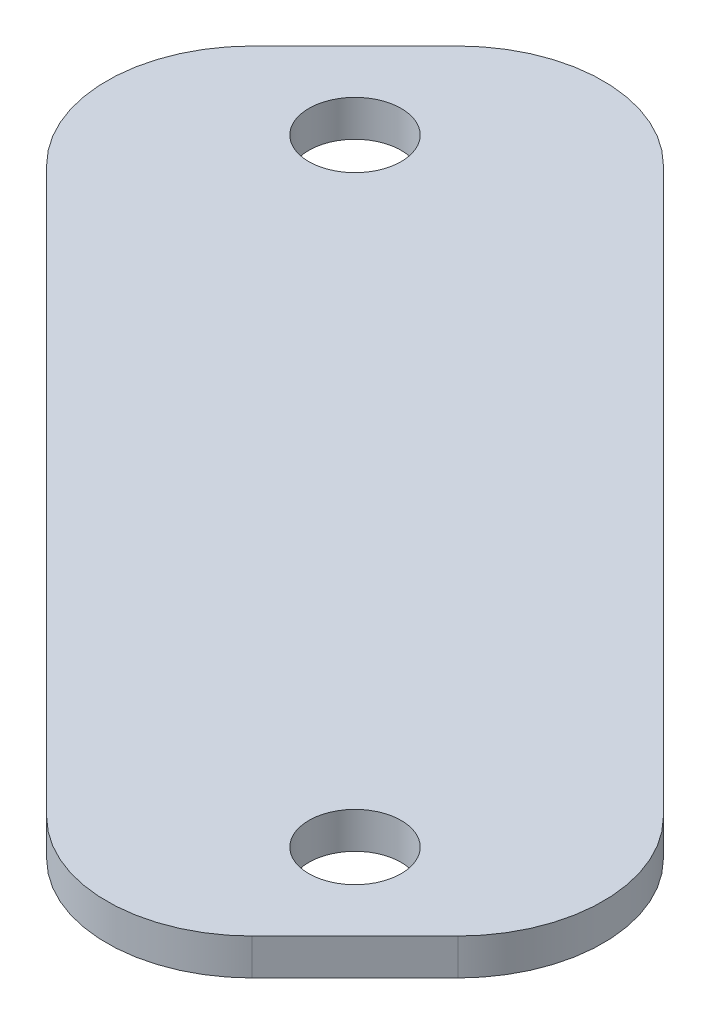
ISO-10303-21;
HEADER;
FILE_DESCRIPTION(('STEP AP214'),'2;1');
FILE_NAME('part.step','',(''),(''),'','','');
FILE_SCHEMA(('AUTOMOTIVE_DESIGN { 1 0 10303 214 1 1 1 1 }'));
ENDSEC;
DATA;
#1=APPLICATION_CONTEXT('core data for automotive mechanical design processes');
#2=APPLICATION_PROTOCOL_DEFINITION('international standard','automotive_design',2000,#1);
#3=PRODUCT_CONTEXT('',#1,'mechanical');
#4=PRODUCT('Part','Part','',(#3));
#5=PRODUCT_RELATED_PRODUCT_CATEGORY('part','',(#4));
#6=PRODUCT_DEFINITION_FORMATION('','',#4);
#7=PRODUCT_DEFINITION_CONTEXT('part definition',#1,'design');
#8=PRODUCT_DEFINITION('design','',#6,#7);
#9=PRODUCT_DEFINITION_SHAPE('','',#8);
#10=(LENGTH_UNIT() NAMED_UNIT(*) SI_UNIT(.MILLI.,.METRE.));
#11=(NAMED_UNIT(*) PLANE_ANGLE_UNIT() SI_UNIT($,.RADIAN.));
#12=(NAMED_UNIT(*) SI_UNIT($,.STERADIAN.) SOLID_ANGLE_UNIT());
#13=UNCERTAINTY_MEASURE_WITH_UNIT(LENGTH_MEASURE(1.E-05),#10,'distance_accuracy_value','');
#14=(GEOMETRIC_REPRESENTATION_CONTEXT(3) GLOBAL_UNCERTAINTY_ASSIGNED_CONTEXT((#13)) GLOBAL_UNIT_ASSIGNED_CONTEXT((#10,
#11,#12)) REPRESENTATION_CONTEXT('',''));
#15=CARTESIAN_POINT('',(0.,0.,0.));
#16=DIRECTION('',(0.,0.,1.));
#17=DIRECTION('',(1.,0.,0.));
#18=AXIS2_PLACEMENT_3D('',#15,#16,#17);
#19=CARTESIAN_POINT('',(42.4264068711928,10.,-42.4264068711928));
#20=DIRECTION('',(0.707106781186548,0.,-0.707106781186548));
#21=DIRECTION('',(-0.707106781186548,0.,-0.707106781186548));
#22=AXIS2_PLACEMENT_3D('',#19,#20,#21);
#23=PLANE('',#22);
#24=DIRECTION('',(0.707106781186548,0.,0.707106781186548));
#25=VECTOR('',#24,1.);
#26=CARTESIAN_POINT('',(42.4264068711928,10.,-42.4264068711928));
#27=LINE('',#26,#25);
#28=CARTESIAN_POINT('',(-35.3553390593274,10.,-120.208152801713));
#29=VERTEX_POINT('',#28);
#30=CARTESIAN_POINT('',(120.208152801713,10.,35.3553390593274));
#31=VERTEX_POINT('',#30);
#32=EDGE_CURVE('E134',#29,#31,#27,.T.);
#33=ORIENTED_EDGE('',*,*,#32,.T.);
#34=DIRECTION('',(0.,-1.,0.));
#35=VECTOR('',#34,1.);
#36=CARTESIAN_POINT('',(120.208152801713,0.,35.3553390593274));
#37=LINE('',#36,#35);
#38=CARTESIAN_POINT('',(120.208152801713,0.,35.3553390593274));
#39=VERTEX_POINT('',#38);
#40=EDGE_CURVE('E161',#31,#39,#37,.T.);
#41=ORIENTED_EDGE('',*,*,#40,.T.);
#42=DIRECTION('',(0.707106781186548,0.,0.707106781186548));
#43=VECTOR('',#42,1.);
#44=CARTESIAN_POINT('',(42.4264068711928,0.,-42.4264068711928));
#45=LINE('',#44,#43);
#46=CARTESIAN_POINT('',(-35.3553390593274,0.,-120.208152801713));
#47=VERTEX_POINT('',#46);
#48=EDGE_CURVE('E169',#47,#39,#45,.T.);
#49=ORIENTED_EDGE('',*,*,#48,.F.);
#50=DIRECTION('',(0.,-1.,0.));
#51=VECTOR('',#50,1.);
#52=CARTESIAN_POINT('',(-35.3553390593273,10.,-120.208152801713));
#53=LINE('',#52,#51);
#54=EDGE_CURVE('E159',#47,#29,#53,.F.);
#55=ORIENTED_EDGE('',*,*,#54,.T.);
#56=EDGE_LOOP('',(#33,#41,#49,#55));
#57=FACE_BOUND('',#56,.T.);
#58=ADVANCED_FACE('F43',(#57),#23,.T.);
#59=CARTESIAN_POINT('',(-106.066017177982,10.,-106.066017177982));
#60=DIRECTION('',(-0.707106781186548,0.,-0.707106781186548));
#61=DIRECTION('',(-0.707106781186548,0.,0.707106781186548));
#62=AXIS2_PLACEMENT_3D('',#59,#60,#61);
#63=PLANE('',#62);
#64=DIRECTION('',(0.707106781186548,0.,-0.707106781186548));
#65=VECTOR('',#64,1.);
#66=CARTESIAN_POINT('',(-106.066017177982,0.,-106.066017177982));
#67=LINE('',#66,#65);
#68=CARTESIAN_POINT('',(-120.208152801713,0.,-91.9238815542512));
#69=VERTEX_POINT('',#68);
#70=CARTESIAN_POINT('',(-91.9238815542512,0.,-120.208152801713));
#71=VERTEX_POINT('',#70);
#72=EDGE_CURVE('E140',#69,#71,#67,.T.);
#73=ORIENTED_EDGE('',*,*,#72,.F.);
#74=DIRECTION('',(0.,-1.,0.));
#75=VECTOR('',#74,1.);
#76=CARTESIAN_POINT('',(-120.208152801713,10.,-91.9238815542512));
#77=LINE('',#76,#75);
#78=CARTESIAN_POINT('',(-120.208152801713,10.,-91.9238815542512));
#79=VERTEX_POINT('',#78);
#80=EDGE_CURVE('E11',#69,#79,#77,.F.);
#81=ORIENTED_EDGE('',*,*,#80,.T.);
#82=DIRECTION('',(0.707106781186548,0.,-0.707106781186548));
#83=VECTOR('',#82,1.);
#84=CARTESIAN_POINT('',(-106.066017177982,10.,-106.066017177982));
#85=LINE('',#84,#83);
#86=CARTESIAN_POINT('',(-91.9238815542512,10.,-120.208152801713));
#87=VERTEX_POINT('',#86);
#88=EDGE_CURVE('E138',#79,#87,#85,.T.);
#89=ORIENTED_EDGE('',*,*,#88,.T.);
#90=DIRECTION('',(0.,-1.,0.));
#91=VECTOR('',#90,1.);
#92=CARTESIAN_POINT('',(-91.9238815542512,10.,-120.208152801713));
#93=LINE('',#92,#91);
#94=EDGE_CURVE('E51',#87,#71,#93,.T.);
#95=ORIENTED_EDGE('',*,*,#94,.T.);
#96=EDGE_LOOP('',(#73,#81,#89,#95));
#97=FACE_BOUND('',#96,.T.);
#98=ADVANCED_FACE('F166',(#97),#63,.T.);
#99=CARTESIAN_POINT('',(-42.4264068711928,10.,42.4264068711928));
#100=DIRECTION('',(0.707106781186548,0.,-0.707106781186548));
#101=DIRECTION('',(-0.707106781186548,0.,-0.707106781186548));
#102=AXIS2_PLACEMENT_3D('',#99,#100,#101);
#103=PLANE('',#102);
#104=DIRECTION('',(0.707106781186548,0.,0.707106781186548));
#105=VECTOR('',#104,1.);
#106=CARTESIAN_POINT('',(-42.4264068711928,0.,42.4264068711928));
#107=LINE('',#106,#105);
#108=CARTESIAN_POINT('',(-120.208152801713,0.,-35.3553390593273));
#109=VERTEX_POINT('',#108);
#110=CARTESIAN_POINT('',(35.3553390593274,0.,120.208152801713));
#111=VERTEX_POINT('',#110);
#112=EDGE_CURVE('E135',#109,#111,#107,.T.);
#113=ORIENTED_EDGE('',*,*,#112,.T.);
#114=DIRECTION('',(0.,-1.,0.));
#115=VECTOR('',#114,1.);
#116=CARTESIAN_POINT('',(35.3553390593274,10.,120.208152801713));
#117=LINE('',#116,#115);
#118=CARTESIAN_POINT('',(35.3553390593274,10.,120.208152801713));
#119=VERTEX_POINT('',#118);
#120=EDGE_CURVE('E113',#111,#119,#117,.F.);
#121=ORIENTED_EDGE('',*,*,#120,.T.);
#122=DIRECTION('',(0.707106781186548,0.,0.707106781186548));
#123=VECTOR('',#122,1.);
#124=CARTESIAN_POINT('',(-42.4264068711928,10.,42.4264068711928));
#125=LINE('',#124,#123);
#126=CARTESIAN_POINT('',(-120.208152801713,10.,-35.3553390593273));
#127=VERTEX_POINT('',#126);
#128=EDGE_CURVE('E174',#127,#119,#125,.T.);
#129=ORIENTED_EDGE('',*,*,#128,.F.);
#130=DIRECTION('',(0.,-1.,0.));
#131=VECTOR('',#130,1.);
#132=CARTESIAN_POINT('',(-120.208152801713,0.,-35.3553390593273));
#133=LINE('',#132,#131);
#134=EDGE_CURVE('E118',#127,#109,#133,.T.);
#135=ORIENTED_EDGE('',*,*,#134,.T.);
#136=EDGE_LOOP('',(#113,#121,#129,#135));
#137=FACE_BOUND('',#136,.T.);
#138=ADVANCED_FACE('F208',(#137),#103,.F.);
#139=CARTESIAN_POINT('',(106.066017177982,10.,106.066017177982));
#140=DIRECTION('',(-0.707106781186547,0.,-0.707106781186548));
#141=DIRECTION('',(-0.707106781186548,0.,0.707106781186547));
#142=AXIS2_PLACEMENT_3D('',#139,#140,#141);
#143=PLANE('',#142);
#144=DIRECTION('',(0.707106781186548,0.,-0.707106781186547));
#145=VECTOR('',#144,1.);
#146=CARTESIAN_POINT('',(106.066017177982,10.,106.066017177982));
#147=LINE('',#146,#145);
#148=CARTESIAN_POINT('',(91.9238815542512,10.,120.208152801713));
#149=VERTEX_POINT('',#148);
#150=CARTESIAN_POINT('',(120.208152801713,10.,91.9238815542512));
#151=VERTEX_POINT('',#150);
#152=EDGE_CURVE('E128',#149,#151,#147,.T.);
#153=ORIENTED_EDGE('',*,*,#152,.F.);
#154=DIRECTION('',(0.,-1.,0.));
#155=VECTOR('',#154,1.);
#156=CARTESIAN_POINT('',(91.9238815542512,10.,120.208152801713));
#157=LINE('',#156,#155);
#158=CARTESIAN_POINT('',(91.9238815542512,0.,120.208152801713));
#159=VERTEX_POINT('',#158);
#160=EDGE_CURVE('E112',#149,#159,#157,.T.);
#161=ORIENTED_EDGE('',*,*,#160,.T.);
#162=DIRECTION('',(0.707106781186548,0.,-0.707106781186547));
#163=VECTOR('',#162,1.);
#164=CARTESIAN_POINT('',(106.066017177982,0.,106.066017177982));
#165=LINE('',#164,#163);
#166=CARTESIAN_POINT('',(120.208152801713,0.,91.9238815542512));
#167=VERTEX_POINT('',#166);
#168=EDGE_CURVE('E125',#159,#167,#165,.T.);
#169=ORIENTED_EDGE('',*,*,#168,.T.);
#170=DIRECTION('',(0.,-1.,0.));
#171=VECTOR('',#170,1.);
#172=CARTESIAN_POINT('',(120.208152801713,10.,91.9238815542512));
#173=LINE('',#172,#171);
#174=EDGE_CURVE('E130',#167,#151,#173,.F.);
#175=ORIENTED_EDGE('',*,*,#174,.T.);
#176=EDGE_LOOP('',(#153,#161,#169,#175));
#177=FACE_BOUND('',#176,.T.);
#178=ADVANCED_FACE('F124',(#177),#143,.F.);
#179=CARTESIAN_POINT('',(0.,10.,0.));
#180=DIRECTION('',(0.,1.,0.));
#181=DIRECTION('',(0.,0.,1.));
#182=AXIS2_PLACEMENT_3D('',#179,#180,#181);
#183=PLANE('',#182);
#184=CARTESIAN_POINT('',(-84.8528137423857,10.,-84.8528137423857));
#185=DIRECTION('',(0.,1.,0.));
#186=DIRECTION('',(0.,0.,1.));
#187=AXIS2_PLACEMENT_3D('',#184,#185,#186);
#188=CIRCLE('',#187,12.7);
#189=CARTESIAN_POINT('',(-84.8528137423857,10.,-72.1528137423857));
#190=VERTEX_POINT('',#189);
#191=EDGE_CURVE('E184',#190,#190,#188,.T.);
#192=ORIENTED_EDGE('',*,*,#191,.F.);
#193=EDGE_LOOP('',(#192));
#194=FACE_BOUND('',#193,.T.);
#195=CARTESIAN_POINT('',(84.8528137423858,10.,84.8528137423857));
#196=DIRECTION('',(0.,1.,0.));
#197=DIRECTION('',(0.,0.,1.));
#198=AXIS2_PLACEMENT_3D('',#195,#196,#197);
#199=CIRCLE('',#198,12.7);
#200=CARTESIAN_POINT('',(84.8528137423858,10.,97.5528137423857));
#201=VERTEX_POINT('',#200);
#202=EDGE_CURVE('E181',#201,#201,#199,.T.);
#203=ORIENTED_EDGE('',*,*,#202,.F.);
#204=EDGE_LOOP('',(#203));
#205=FACE_BOUND('',#204,.T.);
#206=ORIENTED_EDGE('',*,*,#128,.T.);
#207=CARTESIAN_POINT('',(63.6396103067893,10.,91.9238815542512));
#208=DIRECTION('',(0.,1.,0.));
#209=DIRECTION('',(0.,0.,1.));
#210=AXIS2_PLACEMENT_3D('',#207,#208,#209);
#211=CIRCLE('',#210,40.);
#212=EDGE_CURVE('E157',#119,#149,#211,.T.);
#213=ORIENTED_EDGE('',*,*,#212,.T.);
#214=ORIENTED_EDGE('',*,*,#152,.T.);
#215=CARTESIAN_POINT('',(91.9238815542512,10.,63.6396103067893));
#216=DIRECTION('',(0.,1.,0.));
#217=DIRECTION('',(0.,0.,1.));
#218=AXIS2_PLACEMENT_3D('',#215,#216,#217);
#219=CIRCLE('',#218,40.);
#220=EDGE_CURVE('E155',#151,#31,#219,.T.);
#221=ORIENTED_EDGE('',*,*,#220,.T.);
#222=ORIENTED_EDGE('',*,*,#32,.F.);
#223=CARTESIAN_POINT('',(-63.6396103067892,10.,-91.9238815542511));
#224=DIRECTION('',(0.,1.,0.));
#225=DIRECTION('',(0.,0.,1.));
#226=AXIS2_PLACEMENT_3D('',#223,#224,#225);
#227=CIRCLE('',#226,40.);
#228=EDGE_CURVE('E58',#29,#87,#227,.T.);
#229=ORIENTED_EDGE('',*,*,#228,.T.);
#230=ORIENTED_EDGE('',*,*,#88,.F.);
#231=CARTESIAN_POINT('',(-91.9238815542511,10.,-63.6396103067892));
#232=DIRECTION('',(0.,1.,0.));
#233=DIRECTION('',(0.,0.,1.));
#234=AXIS2_PLACEMENT_3D('',#231,#232,#233);
#235=CIRCLE('',#234,40.);
#236=EDGE_CURVE('E153',#79,#127,#235,.T.);
#237=ORIENTED_EDGE('',*,*,#236,.T.);
#238=EDGE_LOOP('',(#206,#213,#214,#221,#222,#229,#230,#237));
#239=FACE_BOUND('',#238,.T.);
#240=ADVANCED_FACE('F199',(#194,#205,#239),#183,.T.);
#241=CARTESIAN_POINT('',(0.,0.,0.));
#242=DIRECTION('',(0.,1.,0.));
#243=DIRECTION('',(0.,0.,1.));
#244=AXIS2_PLACEMENT_3D('',#241,#242,#243);
#245=PLANE('',#244);
#246=CARTESIAN_POINT('',(-84.8528137423857,0.,-84.8528137423857));
#247=DIRECTION('',(0.,1.,0.));
#248=DIRECTION('',(0.,0.,1.));
#249=AXIS2_PLACEMENT_3D('',#246,#247,#248);
#250=CIRCLE('',#249,12.7);
#251=CARTESIAN_POINT('',(-84.8528137423857,0.,-72.1528137423857));
#252=VERTEX_POINT('',#251);
#253=EDGE_CURVE('E170',#252,#252,#250,.T.);
#254=ORIENTED_EDGE('',*,*,#253,.T.);
#255=EDGE_LOOP('',(#254));
#256=FACE_BOUND('',#255,.T.);
#257=CARTESIAN_POINT('',(84.8528137423858,0.,84.8528137423857));
#258=DIRECTION('',(0.,1.,0.));
#259=DIRECTION('',(0.,0.,1.));
#260=AXIS2_PLACEMENT_3D('',#257,#258,#259);
#261=CIRCLE('',#260,12.7);
#262=CARTESIAN_POINT('',(84.8528137423858,0.,97.5528137423857));
#263=VERTEX_POINT('',#262);
#264=EDGE_CURVE('E178',#263,#263,#261,.T.);
#265=ORIENTED_EDGE('',*,*,#264,.T.);
#266=EDGE_LOOP('',(#265));
#267=FACE_BOUND('',#266,.T.);
#268=ORIENTED_EDGE('',*,*,#168,.F.);
#269=CARTESIAN_POINT('',(63.6396103067893,0.,91.9238815542512));
#270=DIRECTION('',(0.,1.,0.));
#271=DIRECTION('',(0.,0.,1.));
#272=AXIS2_PLACEMENT_3D('',#269,#270,#271);
#273=CIRCLE('',#272,40.);
#274=EDGE_CURVE('E108',#159,#111,#273,.F.);
#275=ORIENTED_EDGE('',*,*,#274,.T.);
#276=ORIENTED_EDGE('',*,*,#112,.F.);
#277=CARTESIAN_POINT('',(-91.9238815542511,0.,-63.6396103067892));
#278=DIRECTION('',(0.,1.,0.));
#279=DIRECTION('',(0.,0.,1.));
#280=AXIS2_PLACEMENT_3D('',#277,#278,#279);
#281=CIRCLE('',#280,40.);
#282=EDGE_CURVE('E146',#109,#69,#281,.F.);
#283=ORIENTED_EDGE('',*,*,#282,.T.);
#284=ORIENTED_EDGE('',*,*,#72,.T.);
#285=CARTESIAN_POINT('',(-63.6396103067892,0.,-91.9238815542511));
#286=DIRECTION('',(0.,1.,0.));
#287=DIRECTION('',(0.,0.,1.));
#288=AXIS2_PLACEMENT_3D('',#285,#286,#287);
#289=CIRCLE('',#288,40.);
#290=EDGE_CURVE('E129',#71,#47,#289,.F.);
#291=ORIENTED_EDGE('',*,*,#290,.T.);
#292=ORIENTED_EDGE('',*,*,#48,.T.);
#293=CARTESIAN_POINT('',(91.9238815542512,0.,63.6396103067893));
#294=DIRECTION('',(0.,1.,0.));
#295=DIRECTION('',(0.,0.,1.));
#296=AXIS2_PLACEMENT_3D('',#293,#294,#295);
#297=CIRCLE('',#296,40.);
#298=EDGE_CURVE('E119',#39,#167,#297,.F.);
#299=ORIENTED_EDGE('',*,*,#298,.T.);
#300=EDGE_LOOP('',(#268,#275,#276,#283,#284,#291,#292,#299));
#301=FACE_BOUND('',#300,.T.);
#302=ADVANCED_FACE('F132',(#256,#267,#301),#245,.F.);
#303=CARTESIAN_POINT('',(84.8528137423858,0.,84.8528137423857));
#304=DIRECTION('',(0.,1.,0.));
#305=DIRECTION('',(0.,0.,1.));
#306=AXIS2_PLACEMENT_3D('',#303,#304,#305);
#307=CYLINDRICAL_SURFACE('',#306,12.7);
#308=ORIENTED_EDGE('',*,*,#264,.F.);
#309=EDGE_LOOP('',(#308));
#310=FACE_BOUND('',#309,.T.);
#311=ORIENTED_EDGE('',*,*,#202,.T.);
#312=EDGE_LOOP('',(#311));
#313=FACE_BOUND('',#312,.T.);
#314=ADVANCED_FACE('F195',(#310,#313),#307,.F.);
#315=CARTESIAN_POINT('',(-84.8528137423857,0.,-84.8528137423857));
#316=DIRECTION('',(0.,1.,0.));
#317=DIRECTION('',(0.,0.,1.));
#318=AXIS2_PLACEMENT_3D('',#315,#316,#317);
#319=CYLINDRICAL_SURFACE('',#318,12.7);
#320=ORIENTED_EDGE('',*,*,#253,.F.);
#321=EDGE_LOOP('',(#320));
#322=FACE_BOUND('',#321,.T.);
#323=ORIENTED_EDGE('',*,*,#191,.T.);
#324=EDGE_LOOP('',(#323));
#325=FACE_BOUND('',#324,.T.);
#326=ADVANCED_FACE('F192',(#322,#325),#319,.F.);
#327=CARTESIAN_POINT('',(63.6396103067893,10.,91.9238815542512));
#328=DIRECTION('',(0.,-1.,0.));
#329=DIRECTION('',(0.,0.,-1.));
#330=AXIS2_PLACEMENT_3D('',#327,#328,#329);
#331=CYLINDRICAL_SURFACE('',#330,40.);
#332=ORIENTED_EDGE('',*,*,#212,.F.);
#333=ORIENTED_EDGE('',*,*,#120,.F.);
#334=ORIENTED_EDGE('',*,*,#274,.F.);
#335=ORIENTED_EDGE('',*,*,#160,.F.);
#336=EDGE_LOOP('',(#332,#333,#334,#335));
#337=FACE_BOUND('',#336,.T.);
#338=ADVANCED_FACE('F111',(#337),#331,.T.);
#339=CARTESIAN_POINT('',(91.9238815542512,10.,63.6396103067893));
#340=DIRECTION('',(0.,1.,0.));
#341=DIRECTION('',(0.,0.,1.));
#342=AXIS2_PLACEMENT_3D('',#339,#340,#341);
#343=CYLINDRICAL_SURFACE('',#342,40.);
#344=ORIENTED_EDGE('',*,*,#220,.F.);
#345=ORIENTED_EDGE('',*,*,#174,.F.);
#346=ORIENTED_EDGE('',*,*,#298,.F.);
#347=ORIENTED_EDGE('',*,*,#40,.F.);
#348=EDGE_LOOP('',(#344,#345,#346,#347));
#349=FACE_BOUND('',#348,.T.);
#350=ADVANCED_FACE('F212',(#349),#343,.T.);
#351=CARTESIAN_POINT('',(-91.9238815542511,10.,-63.6396103067892));
#352=DIRECTION('',(0.,1.,0.));
#353=DIRECTION('',(0.,0.,1.));
#354=AXIS2_PLACEMENT_3D('',#351,#352,#353);
#355=CYLINDRICAL_SURFACE('',#354,40.);
#356=ORIENTED_EDGE('',*,*,#236,.F.);
#357=ORIENTED_EDGE('',*,*,#80,.F.);
#358=ORIENTED_EDGE('',*,*,#282,.F.);
#359=ORIENTED_EDGE('',*,*,#134,.F.);
#360=EDGE_LOOP('',(#356,#357,#358,#359));
#361=FACE_BOUND('',#360,.T.);
#362=ADVANCED_FACE('F210',(#361),#355,.T.);
#363=CARTESIAN_POINT('',(-63.6396103067892,10.,-91.9238815542511));
#364=DIRECTION('',(0.,-1.,0.));
#365=DIRECTION('',(0.,0.,-1.));
#366=AXIS2_PLACEMENT_3D('',#363,#364,#365);
#367=CYLINDRICAL_SURFACE('',#366,40.);
#368=ORIENTED_EDGE('',*,*,#228,.F.);
#369=ORIENTED_EDGE('',*,*,#54,.F.);
#370=ORIENTED_EDGE('',*,*,#290,.F.);
#371=ORIENTED_EDGE('',*,*,#94,.F.);
#372=EDGE_LOOP('',(#368,#369,#370,#371));
#373=FACE_BOUND('',#372,.T.);
#374=ADVANCED_FACE('F45',(#373),#367,.T.);
#375=CLOSED_SHELL('',(#58,#98,#138,#178,#240,#302,#314,#326,#338,#350,#362,#374));
#376=MANIFOLD_SOLID_BREP('B2',#375);
#377=ADVANCED_BREP_SHAPE_REPRESENTATION('',(#18,#376),#14);
#378=SHAPE_DEFINITION_REPRESENTATION(#9,#377);
ENDSEC;
END-ISO-10303-21;
